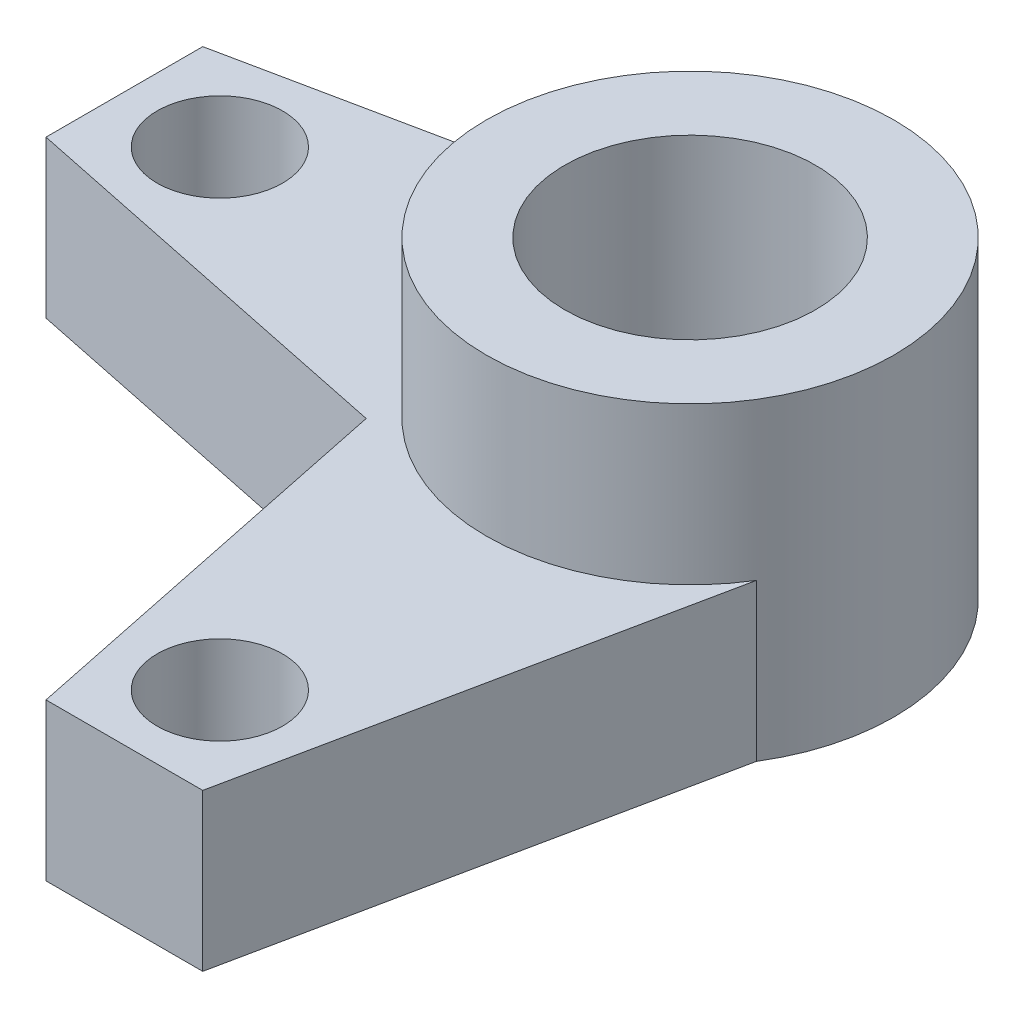
ISO-10303-21;
HEADER;
FILE_DESCRIPTION(('STEP AP214'),'2;1');
FILE_NAME('part.step','',(''),(''),'','','');
FILE_SCHEMA(('AUTOMOTIVE_DESIGN { 1 0 10303 214 1 1 1 1 }'));
ENDSEC;
DATA;
#1=APPLICATION_CONTEXT('core data for automotive mechanical design processes');
#2=APPLICATION_PROTOCOL_DEFINITION('international standard','automotive_design',2000,#1);
#3=PRODUCT_CONTEXT('',#1,'mechanical');
#4=PRODUCT('Part','Part','',(#3));
#5=PRODUCT_RELATED_PRODUCT_CATEGORY('part','',(#4));
#6=PRODUCT_DEFINITION_FORMATION('','',#4);
#7=PRODUCT_DEFINITION_CONTEXT('part definition',#1,'design');
#8=PRODUCT_DEFINITION('design','',#6,#7);
#9=PRODUCT_DEFINITION_SHAPE('','',#8);
#10=(LENGTH_UNIT() NAMED_UNIT(*) SI_UNIT(.MILLI.,.METRE.));
#11=(NAMED_UNIT(*) PLANE_ANGLE_UNIT() SI_UNIT($,.RADIAN.));
#12=(NAMED_UNIT(*) SI_UNIT($,.STERADIAN.) SOLID_ANGLE_UNIT());
#13=UNCERTAINTY_MEASURE_WITH_UNIT(LENGTH_MEASURE(1.E-05),#10,'distance_accuracy_value','');
#14=(GEOMETRIC_REPRESENTATION_CONTEXT(3) GLOBAL_UNCERTAINTY_ASSIGNED_CONTEXT((#13)) GLOBAL_UNIT_ASSIGNED_CONTEXT((#10,
#11,#12)) REPRESENTATION_CONTEXT('',''));
#15=CARTESIAN_POINT('',(0.,0.,0.));
#16=DIRECTION('',(0.,0.,1.));
#17=DIRECTION('',(1.,0.,0.));
#18=AXIS2_PLACEMENT_3D('',#15,#16,#17);
#19=CARTESIAN_POINT('',(0.,5.,0.));
#20=DIRECTION('',(0.,-1.,0.));
#21=DIRECTION('',(0.,0.,-1.));
#22=AXIS2_PLACEMENT_3D('',#19,#20,#21);
#23=CYLINDRICAL_SURFACE('',#22,6.5);
#24=CARTESIAN_POINT('',(0.,0.,0.));
#25=DIRECTION('',(0.,1.,0.));
#26=DIRECTION('',(0.,0.,1.));
#27=AXIS2_PLACEMENT_3D('',#24,#25,#26);
#28=CIRCLE('',#27,6.5);
#29=CARTESIAN_POINT('',(5.52827309214552,0.,3.41880046487944));
#30=VERTEX_POINT('',#29);
#31=CARTESIAN_POINT('',(-3.41880046487946,0.,-5.5282730921455));
#32=VERTEX_POINT('',#31);
#33=EDGE_CURVE('E141',#30,#32,#28,.T.);
#34=ORIENTED_EDGE('',*,*,#33,.T.);
#35=DIRECTION('',(0.,-1.,0.));
#36=VECTOR('',#35,1.);
#37=CARTESIAN_POINT('',(-3.41880046487946,5.,-5.5282730921455));
#38=LINE('',#37,#36);
#39=CARTESIAN_POINT('',(-3.41880046487946,5.,-5.5282730921455));
#40=VERTEX_POINT('',#39);
#41=EDGE_CURVE('E11',#40,#32,#38,.T.);
#42=ORIENTED_EDGE('',*,*,#41,.F.);
#43=CARTESIAN_POINT('',(0.,5.,0.));
#44=DIRECTION('',(0.,1.,0.));
#45=DIRECTION('',(0.,0.,1.));
#46=AXIS2_PLACEMENT_3D('',#43,#44,#45);
#47=CIRCLE('',#46,6.5);
#48=CARTESIAN_POINT('',(5.52827309214551,5.,3.41880046487944));
#49=VERTEX_POINT('',#48);
#50=EDGE_CURVE('E91',#49,#40,#47,.F.);
#51=ORIENTED_EDGE('',*,*,#50,.F.);
#52=DIRECTION('',(0.,-1.,0.));
#53=VECTOR('',#52,1.);
#54=CARTESIAN_POINT('',(5.52827309214552,5.,3.41880046487944));
#55=LINE('',#54,#53);
#56=EDGE_CURVE('E137',#49,#30,#55,.T.);
#57=ORIENTED_EDGE('',*,*,#56,.T.);
#58=EDGE_LOOP('',(#34,#42,#51,#57));
#59=FACE_BOUND('',#58,.T.);
#60=CARTESIAN_POINT('',(0.,10.,0.));
#61=DIRECTION('',(0.,1.,0.));
#62=DIRECTION('',(0.,0.,1.));
#63=AXIS2_PLACEMENT_3D('',#60,#61,#62);
#64=CIRCLE('',#63,6.5);
#65=CARTESIAN_POINT('',(0.,10.,6.5));
#66=VERTEX_POINT('',#65);
#67=EDGE_CURVE('E297',#66,#66,#64,.T.);
#68=ORIENTED_EDGE('',*,*,#67,.F.);
#69=EDGE_LOOP('',(#68));
#70=FACE_BOUND('',#69,.T.);
#71=ADVANCED_FACE('F35',(#59,#70),#23,.T.);
#72=CARTESIAN_POINT('',(-1.2379801589262,5.,-5.9797644963009));
#73=DIRECTION('',(-0.202729268965227,0.,-0.979234825516752));
#74=DIRECTION('',(-0.979234825516753,0.,0.202729268965227));
#75=AXIS2_PLACEMENT_3D('',#72,#73,#74);
#76=PLANE('',#75);
#77=DIRECTION('',(0.979234825516752,0.,-0.202729268965227));
#78=VECTOR('',#77,1.);
#79=CARTESIAN_POINT('',(-1.2379801589262,0.,-5.9797644963009));
#80=LINE('',#79,#78);
#81=CARTESIAN_POINT('',(-18.0461430688367,0.,-2.5));
#82=VERTEX_POINT('',#81);
#83=EDGE_CURVE('E144',#82,#32,#80,.T.);
#84=ORIENTED_EDGE('',*,*,#83,.F.);
#85=DIRECTION('',(0.,-1.,0.));
#86=VECTOR('',#85,1.);
#87=CARTESIAN_POINT('',(-18.0461430688367,5.,-2.5));
#88=LINE('',#87,#86);
#89=CARTESIAN_POINT('',(-18.0461430688367,5.,-2.5));
#90=VERTEX_POINT('',#89);
#91=EDGE_CURVE('E44',#90,#82,#88,.T.);
#92=ORIENTED_EDGE('',*,*,#91,.F.);
#93=DIRECTION('',(0.979234825516752,0.,-0.202729268965227));
#94=VECTOR('',#93,1.);
#95=CARTESIAN_POINT('',(-1.2379801589262,5.,-5.9797644963009));
#96=LINE('',#95,#94);
#97=EDGE_CURVE('E160',#90,#40,#96,.T.);
#98=ORIENTED_EDGE('',*,*,#97,.T.);
#99=ORIENTED_EDGE('',*,*,#41,.T.);
#100=EDGE_LOOP('',(#84,#92,#98,#99));
#101=FACE_BOUND('',#100,.T.);
#102=ADVANCED_FACE('F175',(#101),#76,.T.);
#103=CARTESIAN_POINT('',(-18.0461430688367,5.,0.));
#104=DIRECTION('',(1.,0.,0.));
#105=DIRECTION('',(0.,0.,-1.));
#106=AXIS2_PLACEMENT_3D('',#103,#104,#105);
#107=PLANE('',#106);
#108=DIRECTION('',(0.,0.,1.));
#109=VECTOR('',#108,1.);
#110=CARTESIAN_POINT('',(-18.0461430688367,0.,0.));
#111=LINE('',#110,#109);
#112=CARTESIAN_POINT('',(-18.0461430688367,0.,2.5));
#113=VERTEX_POINT('',#112);
#114=EDGE_CURVE('E147',#82,#113,#111,.T.);
#115=ORIENTED_EDGE('',*,*,#114,.T.);
#116=DIRECTION('',(0.,-1.,0.));
#117=VECTOR('',#116,1.);
#118=CARTESIAN_POINT('',(-18.0461430688367,5.,2.5));
#119=LINE('',#118,#117);
#120=CARTESIAN_POINT('',(-18.0461430688367,5.,2.5));
#121=VERTEX_POINT('',#120);
#122=EDGE_CURVE('E121',#121,#113,#119,.T.);
#123=ORIENTED_EDGE('',*,*,#122,.F.);
#124=DIRECTION('',(0.,0.,1.));
#125=VECTOR('',#124,1.);
#126=CARTESIAN_POINT('',(-18.0461430688367,5.,0.));
#127=LINE('',#126,#125);
#128=EDGE_CURVE('E108',#90,#121,#127,.T.);
#129=ORIENTED_EDGE('',*,*,#128,.F.);
#130=ORIENTED_EDGE('',*,*,#91,.T.);
#131=EDGE_LOOP('',(#115,#123,#129,#130));
#132=FACE_BOUND('',#131,.T.);
#133=ADVANCED_FACE('F167',(#132),#107,.F.);
#134=CARTESIAN_POINT('',(-1.2379801589262,5.,5.9797644963009));
#135=DIRECTION('',(0.202729268965227,0.,-0.979234825516752));
#136=DIRECTION('',(-0.979234825516753,0.,-0.202729268965227));
#137=AXIS2_PLACEMENT_3D('',#134,#135,#136);
#138=PLANE('',#137);
#139=DIRECTION('',(0.979234825516752,0.,0.202729268965227));
#140=VECTOR('',#139,1.);
#141=CARTESIAN_POINT('',(-1.2379801589262,0.,5.9797644963009));
#142=LINE('',#141,#140);
#143=CARTESIAN_POINT('',(-5.16645851112369,0.,5.16645851112371));
#144=VERTEX_POINT('',#143);
#145=EDGE_CURVE('E117',#113,#144,#142,.T.);
#146=ORIENTED_EDGE('',*,*,#145,.T.);
#147=DIRECTION('',(0.,-1.,0.));
#148=VECTOR('',#147,1.);
#149=CARTESIAN_POINT('',(-5.16645851112369,5.,5.16645851112371));
#150=LINE('',#149,#148);
#151=CARTESIAN_POINT('',(-5.16645851112369,5.,5.16645851112371));
#152=VERTEX_POINT('',#151);
#153=EDGE_CURVE('E114',#152,#144,#150,.T.);
#154=ORIENTED_EDGE('',*,*,#153,.F.);
#155=DIRECTION('',(0.979234825516752,0.,0.202729268965227));
#156=VECTOR('',#155,1.);
#157=CARTESIAN_POINT('',(-1.2379801589262,5.,5.9797644963009));
#158=LINE('',#157,#156);
#159=EDGE_CURVE('E101',#121,#152,#158,.T.);
#160=ORIENTED_EDGE('',*,*,#159,.F.);
#161=ORIENTED_EDGE('',*,*,#122,.T.);
#162=EDGE_LOOP('',(#146,#154,#160,#161));
#163=FACE_BOUND('',#162,.T.);
#164=ADVANCED_FACE('F115',(#163),#138,.F.);
#165=CARTESIAN_POINT('',(-5.9797644963009,5.,1.23798015892622));
#166=DIRECTION('',(-0.979234825516752,0.,0.202729268965229));
#167=DIRECTION('',(0.202729268965229,0.,0.979234825516752));
#168=AXIS2_PLACEMENT_3D('',#165,#166,#167);
#169=PLANE('',#168);
#170=DIRECTION('',(-0.202729268965229,0.,-0.979234825516752));
#171=VECTOR('',#170,1.);
#172=CARTESIAN_POINT('',(-5.9797644963009,0.,1.23798015892622));
#173=LINE('',#172,#171);
#174=CARTESIAN_POINT('',(-2.49999999999995,0.,18.0461430688367));
#175=VERTEX_POINT('',#174);
#176=EDGE_CURVE('E150',#175,#144,#173,.T.);
#177=ORIENTED_EDGE('',*,*,#176,.F.);
#178=DIRECTION('',(0.,-1.,0.));
#179=VECTOR('',#178,1.);
#180=CARTESIAN_POINT('',(-2.49999999999995,5.,18.0461430688367));
#181=LINE('',#180,#179);
#182=CARTESIAN_POINT('',(-2.49999999999995,5.,18.0461430688367));
#183=VERTEX_POINT('',#182);
#184=EDGE_CURVE('E122',#183,#175,#181,.T.);
#185=ORIENTED_EDGE('',*,*,#184,.F.);
#186=DIRECTION('',(-0.202729268965229,0.,-0.979234825516752));
#187=VECTOR('',#186,1.);
#188=CARTESIAN_POINT('',(-5.9797644963009,5.,1.23798015892622));
#189=LINE('',#188,#187);
#190=EDGE_CURVE('E106',#183,#152,#189,.T.);
#191=ORIENTED_EDGE('',*,*,#190,.T.);
#192=ORIENTED_EDGE('',*,*,#153,.T.);
#193=EDGE_LOOP('',(#177,#185,#191,#192));
#194=FACE_BOUND('',#193,.T.);
#195=ADVANCED_FACE('F124',(#194),#169,.T.);
#196=CARTESIAN_POINT('',(0.,5.,18.0461430688367));
#197=DIRECTION('',(0.,0.,-1.));
#198=DIRECTION('',(-1.,0.,0.));
#199=AXIS2_PLACEMENT_3D('',#196,#197,#198);
#200=PLANE('',#199);
#201=DIRECTION('',(1.,0.,0.));
#202=VECTOR('',#201,1.);
#203=CARTESIAN_POINT('',(0.,0.,18.0461430688367));
#204=LINE('',#203,#202);
#205=CARTESIAN_POINT('',(2.50000000000005,0.,18.0461430688367));
#206=VERTEX_POINT('',#205);
#207=EDGE_CURVE('E77',#175,#206,#204,.T.);
#208=ORIENTED_EDGE('',*,*,#207,.T.);
#209=DIRECTION('',(0.,-1.,0.));
#210=VECTOR('',#209,1.);
#211=CARTESIAN_POINT('',(2.50000000000005,5.,18.0461430688367));
#212=LINE('',#211,#210);
#213=CARTESIAN_POINT('',(2.50000000000005,5.,18.0461430688367));
#214=VERTEX_POINT('',#213);
#215=EDGE_CURVE('E162',#214,#206,#212,.T.);
#216=ORIENTED_EDGE('',*,*,#215,.F.);
#217=DIRECTION('',(1.,0.,0.));
#218=VECTOR('',#217,1.);
#219=CARTESIAN_POINT('',(0.,5.,18.0461430688367));
#220=LINE('',#219,#218);
#221=EDGE_CURVE('E52',#183,#214,#220,.T.);
#222=ORIENTED_EDGE('',*,*,#221,.F.);
#223=ORIENTED_EDGE('',*,*,#184,.T.);
#224=EDGE_LOOP('',(#208,#216,#222,#223));
#225=FACE_BOUND('',#224,.T.);
#226=ADVANCED_FACE('F180',(#225),#200,.F.);
#227=CARTESIAN_POINT('',(-15.,5.,0.));
#228=DIRECTION('',(0.,-1.,0.));
#229=DIRECTION('',(0.,0.,-1.));
#230=AXIS2_PLACEMENT_3D('',#227,#228,#229);
#231=CYLINDRICAL_SURFACE('',#230,2.);
#232=CARTESIAN_POINT('',(-15.,5.,0.));
#233=DIRECTION('',(0.,1.,0.));
#234=DIRECTION('',(0.,0.,1.));
#235=AXIS2_PLACEMENT_3D('',#232,#233,#234);
#236=CIRCLE('',#235,2.);
#237=CARTESIAN_POINT('',(-15.,5.,2.));
#238=VERTEX_POINT('',#237);
#239=EDGE_CURVE('E131',#238,#238,#236,.T.);
#240=ORIENTED_EDGE('',*,*,#239,.T.);
#241=EDGE_LOOP('',(#240));
#242=FACE_BOUND('',#241,.T.);
#243=CARTESIAN_POINT('',(-15.,0.,0.));
#244=DIRECTION('',(0.,1.,0.));
#245=DIRECTION('',(0.,0.,1.));
#246=AXIS2_PLACEMENT_3D('',#243,#244,#245);
#247=CIRCLE('',#246,2.);
#248=CARTESIAN_POINT('',(-15.,0.,2.));
#249=VERTEX_POINT('',#248);
#250=EDGE_CURVE('E154',#249,#249,#247,.T.);
#251=ORIENTED_EDGE('',*,*,#250,.F.);
#252=EDGE_LOOP('',(#251));
#253=FACE_BOUND('',#252,.T.);
#254=ADVANCED_FACE('F182',(#242,#253),#231,.F.);
#255=CARTESIAN_POINT('',(5.97976449630091,5.,1.23798015892619));
#256=DIRECTION('',(-0.979234825516753,0.,-0.202729268965225));
#257=DIRECTION('',(-0.202729268965225,0.,0.979234825516753));
#258=AXIS2_PLACEMENT_3D('',#255,#256,#257);
#259=PLANE('',#258);
#260=DIRECTION('',(0.202729268965225,0.,-0.979234825516753));
#261=VECTOR('',#260,1.);
#262=CARTESIAN_POINT('',(5.97976449630091,0.,1.23798015892619));
#263=LINE('',#262,#261);
#264=EDGE_CURVE('E84',#206,#30,#263,.T.);
#265=ORIENTED_EDGE('',*,*,#264,.T.);
#266=ORIENTED_EDGE('',*,*,#56,.F.);
#267=DIRECTION('',(0.202729268965225,0.,-0.979234825516753));
#268=VECTOR('',#267,1.);
#269=CARTESIAN_POINT('',(5.97976449630091,5.,1.23798015892619));
#270=LINE('',#269,#268);
#271=EDGE_CURVE('E126',#214,#49,#270,.T.);
#272=ORIENTED_EDGE('',*,*,#271,.F.);
#273=ORIENTED_EDGE('',*,*,#215,.T.);
#274=EDGE_LOOP('',(#265,#266,#272,#273));
#275=FACE_BOUND('',#274,.T.);
#276=ADVANCED_FACE('F179',(#275),#259,.F.);
#277=CARTESIAN_POINT('',(0.,5.,0.));
#278=DIRECTION('',(0.,-1.,0.));
#279=DIRECTION('',(0.,0.,-1.));
#280=AXIS2_PLACEMENT_3D('',#277,#278,#279);
#281=CYLINDRICAL_SURFACE('',#280,4.);
#282=CARTESIAN_POINT('',(0.,0.,0.));
#283=DIRECTION('',(0.,1.,0.));
#284=DIRECTION('',(0.,0.,1.));
#285=AXIS2_PLACEMENT_3D('',#282,#283,#284);
#286=CIRCLE('',#285,4.);
#287=CARTESIAN_POINT('',(0.,0.,4.));
#288=VERTEX_POINT('',#287);
#289=EDGE_CURVE('E138',#288,#288,#286,.T.);
#290=ORIENTED_EDGE('',*,*,#289,.F.);
#291=EDGE_LOOP('',(#290));
#292=FACE_BOUND('',#291,.T.);
#293=CARTESIAN_POINT('',(0.,10.,0.));
#294=DIRECTION('',(0.,1.,0.));
#295=DIRECTION('',(0.,0.,1.));
#296=AXIS2_PLACEMENT_3D('',#293,#294,#295);
#297=CIRCLE('',#296,4.);
#298=CARTESIAN_POINT('',(0.,10.,4.));
#299=VERTEX_POINT('',#298);
#300=EDGE_CURVE('E294',#299,#299,#297,.T.);
#301=ORIENTED_EDGE('',*,*,#300,.T.);
#302=EDGE_LOOP('',(#301));
#303=FACE_BOUND('',#302,.T.);
#304=ADVANCED_FACE('F37',(#292,#303),#281,.F.);
#305=CARTESIAN_POINT('',(0.,5.,15.));
#306=DIRECTION('',(0.,-1.,0.));
#307=DIRECTION('',(0.,0.,-1.));
#308=AXIS2_PLACEMENT_3D('',#305,#306,#307);
#309=CYLINDRICAL_SURFACE('',#308,2.);
#310=CARTESIAN_POINT('',(0.,5.,15.));
#311=DIRECTION('',(0.,1.,0.));
#312=DIRECTION('',(0.,0.,1.));
#313=AXIS2_PLACEMENT_3D('',#310,#311,#312);
#314=CIRCLE('',#313,2.);
#315=CARTESIAN_POINT('',(0.,5.,17.));
#316=VERTEX_POINT('',#315);
#317=EDGE_CURVE('E134',#316,#316,#314,.T.);
#318=ORIENTED_EDGE('',*,*,#317,.T.);
#319=EDGE_LOOP('',(#318));
#320=FACE_BOUND('',#319,.T.);
#321=CARTESIAN_POINT('',(0.,0.,15.));
#322=DIRECTION('',(0.,1.,0.));
#323=DIRECTION('',(0.,0.,1.));
#324=AXIS2_PLACEMENT_3D('',#321,#322,#323);
#325=CIRCLE('',#324,2.);
#326=CARTESIAN_POINT('',(0.,0.,17.));
#327=VERTEX_POINT('',#326);
#328=EDGE_CURVE('E157',#327,#327,#325,.T.);
#329=ORIENTED_EDGE('',*,*,#328,.F.);
#330=EDGE_LOOP('',(#329));
#331=FACE_BOUND('',#330,.T.);
#332=ADVANCED_FACE('F226',(#320,#331),#309,.F.);
#333=CARTESIAN_POINT('',(0.,5.,0.));
#334=DIRECTION('',(0.,1.,0.));
#335=DIRECTION('',(0.,0.,1.));
#336=AXIS2_PLACEMENT_3D('',#333,#334,#335);
#337=PLANE('',#336);
#338=ORIENTED_EDGE('',*,*,#271,.T.);
#339=ORIENTED_EDGE('',*,*,#50,.T.);
#340=ORIENTED_EDGE('',*,*,#97,.F.);
#341=ORIENTED_EDGE('',*,*,#128,.T.);
#342=ORIENTED_EDGE('',*,*,#159,.T.);
#343=ORIENTED_EDGE('',*,*,#190,.F.);
#344=ORIENTED_EDGE('',*,*,#221,.T.);
#345=EDGE_LOOP('',(#338,#339,#340,#341,#342,#343,#344));
#346=FACE_BOUND('',#345,.T.);
#347=ORIENTED_EDGE('',*,*,#239,.F.);
#348=EDGE_LOOP('',(#347));
#349=FACE_BOUND('',#348,.T.);
#350=ORIENTED_EDGE('',*,*,#317,.F.);
#351=EDGE_LOOP('',(#350));
#352=FACE_BOUND('',#351,.T.);
#353=ADVANCED_FACE('F103',(#346,#349,#352),#337,.T.);
#354=CARTESIAN_POINT('',(0.,0.,0.));
#355=DIRECTION('',(0.,1.,0.));
#356=DIRECTION('',(0.,0.,1.));
#357=AXIS2_PLACEMENT_3D('',#354,#355,#356);
#358=PLANE('',#357);
#359=ORIENTED_EDGE('',*,*,#83,.T.);
#360=ORIENTED_EDGE('',*,*,#33,.F.);
#361=ORIENTED_EDGE('',*,*,#264,.F.);
#362=ORIENTED_EDGE('',*,*,#207,.F.);
#363=ORIENTED_EDGE('',*,*,#176,.T.);
#364=ORIENTED_EDGE('',*,*,#145,.F.);
#365=ORIENTED_EDGE('',*,*,#114,.F.);
#366=EDGE_LOOP('',(#359,#360,#361,#362,#363,#364,#365));
#367=FACE_BOUND('',#366,.T.);
#368=ORIENTED_EDGE('',*,*,#250,.T.);
#369=EDGE_LOOP('',(#368));
#370=FACE_BOUND('',#369,.T.);
#371=ORIENTED_EDGE('',*,*,#328,.T.);
#372=EDGE_LOOP('',(#371));
#373=FACE_BOUND('',#372,.T.);
#374=ORIENTED_EDGE('',*,*,#289,.T.);
#375=EDGE_LOOP('',(#374));
#376=FACE_BOUND('',#375,.T.);
#377=ADVANCED_FACE('F172',(#367,#370,#373,#376),#358,.F.);
#378=CARTESIAN_POINT('',(0.,10.,0.));
#379=DIRECTION('',(0.,1.,0.));
#380=DIRECTION('',(0.,0.,1.));
#381=AXIS2_PLACEMENT_3D('',#378,#379,#380);
#382=PLANE('',#381);
#383=ORIENTED_EDGE('',*,*,#300,.F.);
#384=EDGE_LOOP('',(#383));
#385=FACE_BOUND('',#384,.T.);
#386=ORIENTED_EDGE('',*,*,#67,.T.);
#387=EDGE_LOOP('',(#386));
#388=FACE_BOUND('',#387,.T.);
#389=ADVANCED_FACE('F278',(#385,#388),#382,.T.);
#390=CLOSED_SHELL('',(#71,#102,#133,#164,#195,#226,#254,#276,#304,#332,#353,#377,#389));
#391=MANIFOLD_SOLID_BREP('B2',#390);
#392=ADVANCED_BREP_SHAPE_REPRESENTATION('',(#18,#391),#14);
#393=SHAPE_DEFINITION_REPRESENTATION(#9,#392);
ENDSEC;
END-ISO-10303-21;
